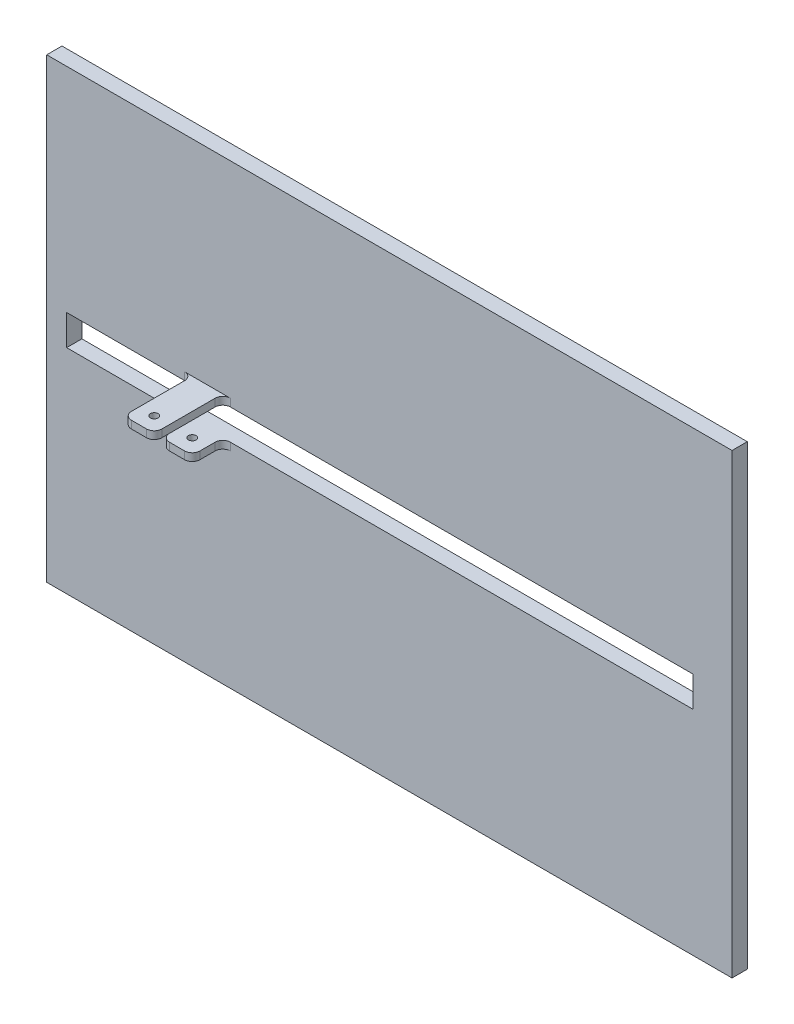
ISO-10303-21;
HEADER;
FILE_DESCRIPTION(('STEP AP214'),'2;1');
FILE_NAME('part.step','',(''),(''),'','','');
FILE_SCHEMA(('AUTOMOTIVE_DESIGN { 1 0 10303 214 1 1 1 1 }'));
ENDSEC;
DATA;
#1=APPLICATION_CONTEXT('core data for automotive mechanical design processes');
#2=APPLICATION_PROTOCOL_DEFINITION('international standard','automotive_design',2000,#1);
#3=PRODUCT_CONTEXT('',#1,'mechanical');
#4=PRODUCT('Part','Part','',(#3));
#5=PRODUCT_RELATED_PRODUCT_CATEGORY('part','',(#4));
#6=PRODUCT_DEFINITION_FORMATION('','',#4);
#7=PRODUCT_DEFINITION_CONTEXT('part definition',#1,'design');
#8=PRODUCT_DEFINITION('design','',#6,#7);
#9=PRODUCT_DEFINITION_SHAPE('','',#8);
#10=(LENGTH_UNIT() NAMED_UNIT(*) SI_UNIT(.MILLI.,.METRE.));
#11=(NAMED_UNIT(*) PLANE_ANGLE_UNIT() SI_UNIT($,.RADIAN.));
#12=(NAMED_UNIT(*) SI_UNIT($,.STERADIAN.) SOLID_ANGLE_UNIT());
#13=UNCERTAINTY_MEASURE_WITH_UNIT(LENGTH_MEASURE(1.E-05),#10,'distance_accuracy_value','');
#14=(GEOMETRIC_REPRESENTATION_CONTEXT(3) GLOBAL_UNCERTAINTY_ASSIGNED_CONTEXT((#13)) GLOBAL_UNIT_ASSIGNED_CONTEXT((#10,
#11,#12)) REPRESENTATION_CONTEXT('',''));
#15=CARTESIAN_POINT('',(0.,0.,0.));
#16=DIRECTION('',(0.,0.,1.));
#17=DIRECTION('',(1.,0.,0.));
#18=AXIS2_PLACEMENT_3D('',#15,#16,#17);
#19=CARTESIAN_POINT('',(-558.838186436975,-20.0000000000002,20.));
#20=DIRECTION('',(0.,1.,0.));
#21=DIRECTION('',(0.,0.,1.));
#22=AXIS2_PLACEMENT_3D('',#19,#20,#21);
#23=PLANE('',#22);
#24=CARTESIAN_POINT('',(-338.838186436974,-19.9999999999991,40.));
#25=DIRECTION('',(0.,-1.,0.));
#26=DIRECTION('',(1.,0.,0.));
#27=AXIS2_PLACEMENT_3D('',#24,#25,#26);
#28=CIRCLE('',#27,4.99999999999999);
#29=CARTESIAN_POINT('',(-333.838186436974,-19.999999999999,40.));
#30=VERTEX_POINT('',#29);
#31=EDGE_CURVE('E377',#30,#30,#28,.T.);
#32=ORIENTED_EDGE('',*,*,#31,.T.);
#33=EDGE_LOOP('',(#32));
#34=FACE_BOUND('',#33,.T.);
#35=DIRECTION('',(1.,0.,0.));
#36=VECTOR('',#35,1.);
#37=CARTESIAN_POINT('',(-558.838186436975,-20.0000000000002,0.));
#38=LINE('',#37,#36);
#39=CARTESIAN_POINT('',(-523.838186436975,-20.0000000000002,0.));
#40=VERTEX_POINT('',#39);
#41=CARTESIAN_POINT('',(298.838186436974,-20.0000000000002,0.));
#42=VERTEX_POINT('',#41);
#43=EDGE_CURVE('E358',#40,#42,#38,.T.);
#44=ORIENTED_EDGE('',*,*,#43,.F.);
#45=DIRECTION('',(0.,0.,-1.));
#46=VECTOR('',#45,1.);
#47=CARTESIAN_POINT('',(-523.838186436975,-20.0000000000002,0.));
#48=LINE('',#47,#46);
#49=CARTESIAN_POINT('',(-523.838186436975,-20.0000000000002,20.));
#50=VERTEX_POINT('',#49);
#51=EDGE_CURVE('E445',#50,#40,#48,.T.);
#52=ORIENTED_EDGE('',*,*,#51,.F.);
#53=DIRECTION('',(1.,0.,0.));
#54=VECTOR('',#53,1.);
#55=CARTESIAN_POINT('',(-558.838186436975,-20.0000000000002,20.));
#56=LINE('',#55,#54);
#57=CARTESIAN_POINT('',(-368.838186436974,-20.0000000000002,20.));
#58=VERTEX_POINT('',#57);
#59=EDGE_CURVE('E419',#50,#58,#56,.T.);
#60=ORIENTED_EDGE('',*,*,#59,.T.);
#61=CARTESIAN_POINT('',(-368.838186436974,-20.0000000000002,30.));
#62=DIRECTION('',(0.,1.,0.));
#63=DIRECTION('',(0.,0.,1.));
#64=AXIS2_PLACEMENT_3D('',#61,#62,#63);
#65=CIRCLE('',#64,10.);
#66=CARTESIAN_POINT('',(-358.838186436974,-19.9999999999992,30.));
#67=VERTEX_POINT('',#66);
#68=EDGE_CURVE('E274',#58,#67,#65,.F.);
#69=ORIENTED_EDGE('',*,*,#68,.T.);
#70=DIRECTION('',(0.,0.,-1.));
#71=VECTOR('',#70,1.);
#72=CARTESIAN_POINT('',(-358.838186436974,-19.9999999999992,60.));
#73=LINE('',#72,#71);
#74=CARTESIAN_POINT('',(-358.838186436974,-19.9999999999992,50.));
#75=VERTEX_POINT('',#74);
#76=EDGE_CURVE('E399',#75,#67,#73,.T.);
#77=ORIENTED_EDGE('',*,*,#76,.F.);
#78=CARTESIAN_POINT('',(-348.838186436974,-20.0000000000002,50.));
#79=DIRECTION('',(0.,1.,0.));
#80=DIRECTION('',(0.,0.,1.));
#81=AXIS2_PLACEMENT_3D('',#78,#79,#80);
#82=CIRCLE('',#81,10.);
#83=CARTESIAN_POINT('',(-348.838186436974,-19.9999999999991,60.));
#84=VERTEX_POINT('',#83);
#85=EDGE_CURVE('E317',#75,#84,#82,.T.);
#86=ORIENTED_EDGE('',*,*,#85,.T.);
#87=DIRECTION('',(-1.,0.,0.));
#88=VECTOR('',#87,1.);
#89=CARTESIAN_POINT('',(-318.838186436974,-19.9999999999989,60.));
#90=LINE('',#89,#88);
#91=CARTESIAN_POINT('',(-328.838186436974,-19.999999999999,60.));
#92=VERTEX_POINT('',#91);
#93=EDGE_CURVE('E390',#92,#84,#90,.T.);
#94=ORIENTED_EDGE('',*,*,#93,.F.);
#95=CARTESIAN_POINT('',(-328.838186436974,-20.0000000000002,50.));
#96=DIRECTION('',(0.,1.,0.));
#97=DIRECTION('',(0.,0.,1.));
#98=AXIS2_PLACEMENT_3D('',#95,#96,#97);
#99=CIRCLE('',#98,10.);
#100=CARTESIAN_POINT('',(-318.838186436974,-19.9999999999989,50.));
#101=VERTEX_POINT('',#100);
#102=EDGE_CURVE('E297',#92,#101,#99,.T.);
#103=ORIENTED_EDGE('',*,*,#102,.T.);
#104=DIRECTION('',(0.,0.,-1.));
#105=VECTOR('',#104,1.);
#106=CARTESIAN_POINT('',(-318.838186436974,-19.9999999999989,60.));
#107=LINE('',#106,#105);
#108=CARTESIAN_POINT('',(-318.838186436974,-19.9999999999989,30.));
#109=VERTEX_POINT('',#108);
#110=EDGE_CURVE('E402',#101,#109,#107,.T.);
#111=ORIENTED_EDGE('',*,*,#110,.T.);
#112=CARTESIAN_POINT('',(-308.838186436974,-20.0000000000002,30.));
#113=DIRECTION('',(0.,1.,0.));
#114=DIRECTION('',(0.,0.,1.));
#115=AXIS2_PLACEMENT_3D('',#112,#113,#114);
#116=CIRCLE('',#115,10.);
#117=CARTESIAN_POINT('',(-308.838186436974,-20.0000000000002,20.));
#118=VERTEX_POINT('',#117);
#119=EDGE_CURVE('E239',#109,#118,#116,.F.);
#120=ORIENTED_EDGE('',*,*,#119,.T.);
#121=CARTESIAN_POINT('',(298.838186436974,-20.0000000000002,20.));
#122=VERTEX_POINT('',#121);
#123=EDGE_CURVE('E423',#118,#122,#56,.T.);
#124=ORIENTED_EDGE('',*,*,#123,.T.);
#125=DIRECTION('',(0.,0.,1.));
#126=VECTOR('',#125,1.);
#127=CARTESIAN_POINT('',(298.838186436974,-20.0000000000002,20.));
#128=LINE('',#127,#126);
#129=EDGE_CURVE('E462',#42,#122,#128,.T.);
#130=ORIENTED_EDGE('',*,*,#129,.F.);
#131=EDGE_LOOP('',(#44,#52,#60,#69,#77,#86,#94,#103,#111,#120,#124,#130));
#132=FACE_BOUND('',#131,.T.);
#133=ADVANCED_FACE('F39',(#34,#132),#23,.T.);
#134=CARTESIAN_POINT('',(558.838186436974,20.,20.));
#135=DIRECTION('',(0.,-1.,0.));
#136=DIRECTION('',(0.,0.,-1.));
#137=AXIS2_PLACEMENT_3D('',#134,#135,#136);
#138=PLANE('',#137);
#139=CARTESIAN_POINT('',(-338.838186436975,20.,90.));
#140=DIRECTION('',(0.,-1.,0.));
#141=DIRECTION('',(0.,0.,-1.));
#142=AXIS2_PLACEMENT_3D('',#139,#140,#141);
#143=CIRCLE('',#142,4.99999999999999);
#144=CARTESIAN_POINT('',(-338.838186436975,20.,85.));
#145=VERTEX_POINT('',#144);
#146=EDGE_CURVE('E471',#145,#145,#143,.T.);
#147=ORIENTED_EDGE('',*,*,#146,.F.);
#148=EDGE_LOOP('',(#147));
#149=FACE_BOUND('',#148,.T.);
#150=DIRECTION('',(-1.,0.,0.));
#151=VECTOR('',#150,1.);
#152=CARTESIAN_POINT('',(558.838186436974,20.,20.));
#153=LINE('',#152,#151);
#154=CARTESIAN_POINT('',(-368.838186436975,20.,20.));
#155=VERTEX_POINT('',#154);
#156=CARTESIAN_POINT('',(-523.838186436975,20.,20.));
#157=VERTEX_POINT('',#156);
#158=EDGE_CURVE('E422',#155,#157,#153,.T.);
#159=ORIENTED_EDGE('',*,*,#158,.T.);
#160=DIRECTION('',(0.,0.,1.));
#161=VECTOR('',#160,1.);
#162=CARTESIAN_POINT('',(-523.838186436975,20.,20.));
#163=LINE('',#162,#161);
#164=CARTESIAN_POINT('',(-523.838186436975,20.,0.));
#165=VERTEX_POINT('',#164);
#166=EDGE_CURVE('E455',#165,#157,#163,.T.);
#167=ORIENTED_EDGE('',*,*,#166,.F.);
#168=DIRECTION('',(-1.,0.,0.));
#169=VECTOR('',#168,1.);
#170=CARTESIAN_POINT('',(558.838186436974,20.,0.));
#171=LINE('',#170,#169);
#172=CARTESIAN_POINT('',(298.838186436974,20.,0.));
#173=VERTEX_POINT('',#172);
#174=EDGE_CURVE('E428',#173,#165,#171,.T.);
#175=ORIENTED_EDGE('',*,*,#174,.F.);
#176=DIRECTION('',(0.,0.,-1.));
#177=VECTOR('',#176,1.);
#178=CARTESIAN_POINT('',(298.838186436974,20.,0.));
#179=LINE('',#178,#177);
#180=CARTESIAN_POINT('',(298.838186436974,20.,20.));
#181=VERTEX_POINT('',#180);
#182=EDGE_CURVE('E468',#181,#173,#179,.T.);
#183=ORIENTED_EDGE('',*,*,#182,.F.);
#184=CARTESIAN_POINT('',(-308.838186436974,20.,20.));
#185=VERTEX_POINT('',#184);
#186=EDGE_CURVE('E227',#181,#185,#153,.T.);
#187=ORIENTED_EDGE('',*,*,#186,.T.);
#188=CARTESIAN_POINT('',(-308.838186436974,20.,30.));
#189=DIRECTION('',(0.,-1.,0.));
#190=DIRECTION('',(0.,0.,-1.));
#191=AXIS2_PLACEMENT_3D('',#188,#189,#190);
#192=CIRCLE('',#191,10.);
#193=CARTESIAN_POINT('',(-318.838186436974,20.,30.));
#194=VERTEX_POINT('',#193);
#195=EDGE_CURVE('E258',#185,#194,#192,.F.);
#196=ORIENTED_EDGE('',*,*,#195,.T.);
#197=DIRECTION('',(0.,0.,-1.));
#198=VECTOR('',#197,1.);
#199=CARTESIAN_POINT('',(-318.838186436974,20.,60.));
#200=LINE('',#199,#198);
#201=CARTESIAN_POINT('',(-318.838186436974,20.,100.));
#202=VERTEX_POINT('',#201);
#203=EDGE_CURVE('E346',#202,#194,#200,.T.);
#204=ORIENTED_EDGE('',*,*,#203,.F.);
#205=CARTESIAN_POINT('',(-328.838186436974,20.,100.));
#206=DIRECTION('',(0.,-1.,0.));
#207=DIRECTION('',(0.,0.,-1.));
#208=AXIS2_PLACEMENT_3D('',#205,#206,#207);
#209=CIRCLE('',#208,10.);
#210=CARTESIAN_POINT('',(-328.838186436974,20.,110.));
#211=VERTEX_POINT('',#210);
#212=EDGE_CURVE('E11',#202,#211,#209,.T.);
#213=ORIENTED_EDGE('',*,*,#212,.T.);
#214=DIRECTION('',(1.,0.,0.));
#215=VECTOR('',#214,1.);
#216=CARTESIAN_POINT('',(-318.838186436974,20.,110.));
#217=LINE('',#216,#215);
#218=CARTESIAN_POINT('',(-348.838186436974,20.,110.));
#219=VERTEX_POINT('',#218);
#220=EDGE_CURVE('E365',#219,#211,#217,.T.);
#221=ORIENTED_EDGE('',*,*,#220,.F.);
#222=CARTESIAN_POINT('',(-348.838186436974,20.,100.));
#223=DIRECTION('',(0.,-1.,0.));
#224=DIRECTION('',(0.,0.,-1.));
#225=AXIS2_PLACEMENT_3D('',#222,#223,#224);
#226=CIRCLE('',#225,10.);
#227=CARTESIAN_POINT('',(-358.838186436974,20.,100.));
#228=VERTEX_POINT('',#227);
#229=EDGE_CURVE('E324',#219,#228,#226,.T.);
#230=ORIENTED_EDGE('',*,*,#229,.T.);
#231=DIRECTION('',(0.,0.,-1.));
#232=VECTOR('',#231,1.);
#233=CARTESIAN_POINT('',(-358.838186436974,20.,60.));
#234=LINE('',#233,#232);
#235=CARTESIAN_POINT('',(-358.838186436974,20.,30.));
#236=VERTEX_POINT('',#235);
#237=EDGE_CURVE('E411',#228,#236,#234,.T.);
#238=ORIENTED_EDGE('',*,*,#237,.T.);
#239=CARTESIAN_POINT('',(-368.838186436974,20.,30.));
#240=DIRECTION('',(0.,-1.,0.));
#241=DIRECTION('',(0.,0.,-1.));
#242=AXIS2_PLACEMENT_3D('',#239,#240,#241);
#243=CIRCLE('',#242,10.);
#244=EDGE_CURVE('E286',#236,#155,#243,.F.);
#245=ORIENTED_EDGE('',*,*,#244,.T.);
#246=EDGE_LOOP('',(#159,#167,#175,#183,#187,#196,#204,#213,#221,#230,#238,#245));
#247=FACE_BOUND('',#246,.T.);
#248=ADVANCED_FACE('F352',(#149,#247),#138,.T.);
#249=CARTESIAN_POINT('',(0.,0.,20.));
#250=DIRECTION('',(0.,0.,1.));
#251=DIRECTION('',(1.,0.,0.));
#252=AXIS2_PLACEMENT_3D('',#249,#250,#251);
#253=PLANE('',#252);
#254=DIRECTION('',(0.,-1.,0.));
#255=VECTOR('',#254,1.);
#256=CARTESIAN_POINT('',(350.,-300.,20.));
#257=LINE('',#256,#255);
#258=CARTESIAN_POINT('',(350.,300.,20.));
#259=VERTEX_POINT('',#258);
#260=CARTESIAN_POINT('',(350.,-300.,20.));
#261=VERTEX_POINT('',#260);
#262=EDGE_CURVE('E55',#259,#261,#257,.T.);
#263=ORIENTED_EDGE('',*,*,#262,.F.);
#264=DIRECTION('',(-1.,0.,0.));
#265=VECTOR('',#264,1.);
#266=CARTESIAN_POINT('',(-650.,300.,20.));
#267=LINE('',#266,#265);
#268=CARTESIAN_POINT('',(-550.,300.,20.));
#269=VERTEX_POINT('',#268);
#270=EDGE_CURVE('E221',#259,#269,#267,.T.);
#271=ORIENTED_EDGE('',*,*,#270,.T.);
#272=DIRECTION('',(0.,1.,0.));
#273=VECTOR('',#272,1.);
#274=CARTESIAN_POINT('',(-550.,300.,20.));
#275=LINE('',#274,#273);
#276=CARTESIAN_POINT('',(-550.,-300.,20.));
#277=VERTEX_POINT('',#276);
#278=EDGE_CURVE('E438',#277,#269,#275,.T.);
#279=ORIENTED_EDGE('',*,*,#278,.F.);
#280=DIRECTION('',(1.,0.,0.));
#281=VECTOR('',#280,1.);
#282=CARTESIAN_POINT('',(-650.,-300.,20.));
#283=LINE('',#282,#281);
#284=EDGE_CURVE('E225',#277,#261,#283,.T.);
#285=ORIENTED_EDGE('',*,*,#284,.T.);
#286=EDGE_LOOP('',(#263,#271,#279,#285));
#287=FACE_BOUND('',#286,.T.);
#288=ORIENTED_EDGE('',*,*,#59,.F.);
#289=DIRECTION('',(0.,-1.,0.));
#290=VECTOR('',#289,1.);
#291=CARTESIAN_POINT('',(-523.838186436975,-20.0000000000002,20.));
#292=LINE('',#291,#290);
#293=EDGE_CURVE('E441',#157,#50,#292,.T.);
#294=ORIENTED_EDGE('',*,*,#293,.F.);
#295=ORIENTED_EDGE('',*,*,#158,.F.);
#296=DIRECTION('',(0.,-1.,0.));
#297=VECTOR('',#296,1.);
#298=CARTESIAN_POINT('',(-368.838186436974,0.,20.));
#299=LINE('',#298,#297);
#300=CARTESIAN_POINT('',(-368.838186436974,30.,20.));
#301=VERTEX_POINT('',#300);
#302=EDGE_CURVE('E282',#155,#301,#299,.F.);
#303=ORIENTED_EDGE('',*,*,#302,.T.);
#304=DIRECTION('',(-1.,0.,0.));
#305=VECTOR('',#304,1.);
#306=CARTESIAN_POINT('',(-358.838186436974,30.,20.));
#307=LINE('',#306,#305);
#308=CARTESIAN_POINT('',(-308.838186436974,30.,20.));
#309=VERTEX_POINT('',#308);
#310=EDGE_CURVE('E408',#309,#301,#307,.T.);
#311=ORIENTED_EDGE('',*,*,#310,.F.);
#312=DIRECTION('',(0.,1.,0.));
#313=VECTOR('',#312,1.);
#314=CARTESIAN_POINT('',(-308.838186436974,0.,20.));
#315=LINE('',#314,#313);
#316=EDGE_CURVE('E250',#309,#185,#315,.F.);
#317=ORIENTED_EDGE('',*,*,#316,.T.);
#318=ORIENTED_EDGE('',*,*,#186,.F.);
#319=DIRECTION('',(0.,1.,0.));
#320=VECTOR('',#319,1.);
#321=CARTESIAN_POINT('',(298.838186436974,20.,20.));
#322=LINE('',#321,#320);
#323=EDGE_CURVE('E465',#122,#181,#322,.T.);
#324=ORIENTED_EDGE('',*,*,#323,.F.);
#325=ORIENTED_EDGE('',*,*,#123,.F.);
#326=DIRECTION('',(0.,1.,0.));
#327=VECTOR('',#326,1.);
#328=CARTESIAN_POINT('',(-308.838186436974,-1.71439632732902E-12,20.));
#329=LINE('',#328,#327);
#330=CARTESIAN_POINT('',(-308.838186436974,-29.9999999999989,20.));
#331=VERTEX_POINT('',#330);
#332=EDGE_CURVE('E235',#118,#331,#329,.F.);
#333=ORIENTED_EDGE('',*,*,#332,.T.);
#334=DIRECTION('',(1.,0.,0.));
#335=VECTOR('',#334,1.);
#336=CARTESIAN_POINT('',(-358.838186436974,-29.9999999999992,20.));
#337=LINE('',#336,#335);
#338=CARTESIAN_POINT('',(-368.838186436974,-29.9999999999992,20.));
#339=VERTEX_POINT('',#338);
#340=EDGE_CURVE('E385',#339,#331,#337,.T.);
#341=ORIENTED_EDGE('',*,*,#340,.F.);
#342=DIRECTION('',(0.,-1.,0.));
#343=VECTOR('',#342,1.);
#344=CARTESIAN_POINT('',(-368.838186436974,-2.04746323471658E-12,20.));
#345=LINE('',#344,#343);
#346=EDGE_CURVE('E266',#339,#58,#345,.F.);
#347=ORIENTED_EDGE('',*,*,#346,.T.);
#348=EDGE_LOOP('',(#288,#294,#295,#303,#311,#317,#318,#324,#325,#333,#341,#347));
#349=FACE_BOUND('',#348,.T.);
#350=ADVANCED_FACE('F434',(#287,#349),#253,.T.);
#351=CARTESIAN_POINT('',(0.,0.,0.));
#352=DIRECTION('',(0.,0.,1.));
#353=DIRECTION('',(1.,0.,0.));
#354=AXIS2_PLACEMENT_3D('',#351,#352,#353);
#355=PLANE('',#354);
#356=DIRECTION('',(0.,1.,0.));
#357=VECTOR('',#356,1.);
#358=CARTESIAN_POINT('',(-523.838186436975,20.,0.));
#359=LINE('',#358,#357);
#360=EDGE_CURVE('E452',#40,#165,#359,.T.);
#361=ORIENTED_EDGE('',*,*,#360,.F.);
#362=ORIENTED_EDGE('',*,*,#43,.T.);
#363=DIRECTION('',(0.,-1.,0.));
#364=VECTOR('',#363,1.);
#365=CARTESIAN_POINT('',(298.838186436974,-20.0000000000002,0.));
#366=LINE('',#365,#364);
#367=EDGE_CURVE('E458',#173,#42,#366,.T.);
#368=ORIENTED_EDGE('',*,*,#367,.F.);
#369=ORIENTED_EDGE('',*,*,#174,.T.);
#370=EDGE_LOOP('',(#361,#362,#368,#369));
#371=FACE_BOUND('',#370,.T.);
#372=DIRECTION('',(-1.,0.,0.));
#373=VECTOR('',#372,1.);
#374=CARTESIAN_POINT('',(-650.,300.,0.));
#375=LINE('',#374,#373);
#376=CARTESIAN_POINT('',(350.,300.,0.));
#377=VERTEX_POINT('',#376);
#378=CARTESIAN_POINT('',(-550.,300.,0.));
#379=VERTEX_POINT('',#378);
#380=EDGE_CURVE('E214',#377,#379,#375,.T.);
#381=ORIENTED_EDGE('',*,*,#380,.F.);
#382=DIRECTION('',(0.,1.,0.));
#383=VECTOR('',#382,1.);
#384=CARTESIAN_POINT('',(350.,300.,0.));
#385=LINE('',#384,#383);
#386=CARTESIAN_POINT('',(350.,-300.,0.));
#387=VERTEX_POINT('',#386);
#388=EDGE_CURVE('E201',#387,#377,#385,.T.);
#389=ORIENTED_EDGE('',*,*,#388,.F.);
#390=DIRECTION('',(1.,0.,0.));
#391=VECTOR('',#390,1.);
#392=CARTESIAN_POINT('',(-650.,-300.,0.));
#393=LINE('',#392,#391);
#394=CARTESIAN_POINT('',(-550.,-300.,0.));
#395=VERTEX_POINT('',#394);
#396=EDGE_CURVE('E213',#395,#387,#393,.T.);
#397=ORIENTED_EDGE('',*,*,#396,.F.);
#398=DIRECTION('',(0.,-1.,0.));
#399=VECTOR('',#398,1.);
#400=CARTESIAN_POINT('',(-550.,-300.,0.));
#401=LINE('',#400,#399);
#402=EDGE_CURVE('E63',#379,#395,#401,.T.);
#403=ORIENTED_EDGE('',*,*,#402,.F.);
#404=EDGE_LOOP('',(#381,#389,#397,#403));
#405=FACE_BOUND('',#404,.T.);
#406=ADVANCED_FACE('F212',(#371,#405),#355,.F.);
#407=CARTESIAN_POINT('',(-650.,300.,20.));
#408=DIRECTION('',(0.,-1.,0.));
#409=DIRECTION('',(0.,0.,-1.));
#410=AXIS2_PLACEMENT_3D('',#407,#408,#409);
#411=PLANE('',#410);
#412=ORIENTED_EDGE('',*,*,#270,.F.);
#413=DIRECTION('',(0.,0.,1.));
#414=VECTOR('',#413,1.);
#415=CARTESIAN_POINT('',(350.,300.,20.));
#416=LINE('',#415,#414);
#417=EDGE_CURVE('E216',#377,#259,#416,.T.);
#418=ORIENTED_EDGE('',*,*,#417,.F.);
#419=ORIENTED_EDGE('',*,*,#380,.T.);
#420=DIRECTION('',(0.,0.,-1.));
#421=VECTOR('',#420,1.);
#422=CARTESIAN_POINT('',(-550.,300.,0.));
#423=LINE('',#422,#421);
#424=EDGE_CURVE('E760',#269,#379,#423,.T.);
#425=ORIENTED_EDGE('',*,*,#424,.F.);
#426=EDGE_LOOP('',(#412,#418,#419,#425));
#427=FACE_BOUND('',#426,.T.);
#428=ADVANCED_FACE('F495',(#427),#411,.F.);
#429=CARTESIAN_POINT('',(-650.,-300.,20.));
#430=DIRECTION('',(0.,1.,0.));
#431=DIRECTION('',(0.,0.,1.));
#432=AXIS2_PLACEMENT_3D('',#429,#430,#431);
#433=PLANE('',#432);
#434=ORIENTED_EDGE('',*,*,#396,.T.);
#435=DIRECTION('',(0.,0.,-1.));
#436=VECTOR('',#435,1.);
#437=CARTESIAN_POINT('',(350.,-300.,0.));
#438=LINE('',#437,#436);
#439=EDGE_CURVE('E198',#261,#387,#438,.T.);
#440=ORIENTED_EDGE('',*,*,#439,.F.);
#441=ORIENTED_EDGE('',*,*,#284,.F.);
#442=DIRECTION('',(0.,0.,1.));
#443=VECTOR('',#442,1.);
#444=CARTESIAN_POINT('',(-550.,-300.,20.));
#445=LINE('',#444,#443);
#446=EDGE_CURVE('E219',#395,#277,#445,.T.);
#447=ORIENTED_EDGE('',*,*,#446,.F.);
#448=EDGE_LOOP('',(#434,#440,#441,#447));
#449=FACE_BOUND('',#448,.T.);
#450=ADVANCED_FACE('F218',(#449),#433,.F.);
#451=CARTESIAN_POINT('',(-318.838186436974,30.,60.));
#452=DIRECTION('',(-1.,0.,0.));
#453=DIRECTION('',(0.,0.,1.));
#454=AXIS2_PLACEMENT_3D('',#451,#452,#453);
#455=PLANE('',#454);
#456=DIRECTION('',(0.,0.,-1.));
#457=VECTOR('',#456,1.);
#458=CARTESIAN_POINT('',(-318.838186436974,30.,60.));
#459=LINE('',#458,#457);
#460=CARTESIAN_POINT('',(-318.838186436974,30.,100.));
#461=VERTEX_POINT('',#460);
#462=CARTESIAN_POINT('',(-318.838186436974,30.,30.));
#463=VERTEX_POINT('',#462);
#464=EDGE_CURVE('E347',#461,#463,#459,.T.);
#465=ORIENTED_EDGE('',*,*,#464,.F.);
#466=DIRECTION('',(0.,1.,0.));
#467=VECTOR('',#466,1.);
#468=CARTESIAN_POINT('',(-318.838186436974,30.,100.));
#469=LINE('',#468,#467);
#470=EDGE_CURVE('E48',#461,#202,#469,.F.);
#471=ORIENTED_EDGE('',*,*,#470,.T.);
#472=ORIENTED_EDGE('',*,*,#203,.T.);
#473=DIRECTION('',(0.,1.,0.));
#474=VECTOR('',#473,1.);
#475=CARTESIAN_POINT('',(-318.838186436974,30.,30.));
#476=LINE('',#475,#474);
#477=EDGE_CURVE('E246',#194,#463,#476,.T.);
#478=ORIENTED_EDGE('',*,*,#477,.T.);
#479=EDGE_LOOP('',(#465,#471,#472,#478));
#480=FACE_BOUND('',#479,.T.);
#481=ADVANCED_FACE('F345',(#480),#455,.F.);
#482=CARTESIAN_POINT('',(-358.838186436974,30.,60.));
#483=DIRECTION('',(0.,-1.,0.));
#484=DIRECTION('',(0.,0.,-1.));
#485=AXIS2_PLACEMENT_3D('',#482,#483,#484);
#486=PLANE('',#485);
#487=CARTESIAN_POINT('',(-338.838186436975,30.,90.));
#488=DIRECTION('',(0.,-1.,0.));
#489=DIRECTION('',(0.,0.,-1.));
#490=AXIS2_PLACEMENT_3D('',#487,#488,#489);
#491=CIRCLE('',#490,4.99999999999999);
#492=CARTESIAN_POINT('',(-338.838186436975,30.,85.));
#493=VERTEX_POINT('',#492);
#494=EDGE_CURVE('E379',#493,#493,#491,.T.);
#495=ORIENTED_EDGE('',*,*,#494,.T.);
#496=EDGE_LOOP('',(#495));
#497=FACE_BOUND('',#496,.T.);
#498=DIRECTION('',(-1.,0.,0.));
#499=VECTOR('',#498,1.);
#500=CARTESIAN_POINT('',(-358.838186436974,30.,110.));
#501=LINE('',#500,#499);
#502=CARTESIAN_POINT('',(-328.838186436974,30.,110.));
#503=VERTEX_POINT('',#502);
#504=CARTESIAN_POINT('',(-348.838186436974,30.,110.));
#505=VERTEX_POINT('',#504);
#506=EDGE_CURVE('E364',#503,#505,#501,.T.);
#507=ORIENTED_EDGE('',*,*,#506,.F.);
#508=CARTESIAN_POINT('',(-328.838186436974,30.,100.));
#509=DIRECTION('',(0.,-1.,0.));
#510=DIRECTION('',(0.,0.,-1.));
#511=AXIS2_PLACEMENT_3D('',#508,#509,#510);
#512=CIRCLE('',#511,10.);
#513=EDGE_CURVE('E338',#503,#461,#512,.F.);
#514=ORIENTED_EDGE('',*,*,#513,.T.);
#515=ORIENTED_EDGE('',*,*,#464,.T.);
#516=CARTESIAN_POINT('',(-308.838186436974,30.,30.));
#517=DIRECTION('',(0.,-1.,0.));
#518=DIRECTION('',(0.,0.,-1.));
#519=AXIS2_PLACEMENT_3D('',#516,#517,#518);
#520=CIRCLE('',#519,10.);
#521=EDGE_CURVE('E254',#463,#309,#520,.T.);
#522=ORIENTED_EDGE('',*,*,#521,.T.);
#523=ORIENTED_EDGE('',*,*,#310,.T.);
#524=CARTESIAN_POINT('',(-368.838186436974,30.,30.));
#525=DIRECTION('',(0.,-1.,0.));
#526=DIRECTION('',(0.,0.,-1.));
#527=AXIS2_PLACEMENT_3D('',#524,#525,#526);
#528=CIRCLE('',#527,10.);
#529=CARTESIAN_POINT('',(-358.838186436974,30.,30.));
#530=VERTEX_POINT('',#529);
#531=EDGE_CURVE('E289',#301,#530,#528,.T.);
#532=ORIENTED_EDGE('',*,*,#531,.T.);
#533=DIRECTION('',(0.,0.,-1.));
#534=VECTOR('',#533,1.);
#535=CARTESIAN_POINT('',(-358.838186436974,30.,60.));
#536=LINE('',#535,#534);
#537=CARTESIAN_POINT('',(-358.838186436974,30.,100.));
#538=VERTEX_POINT('',#537);
#539=EDGE_CURVE('E414',#538,#530,#536,.T.);
#540=ORIENTED_EDGE('',*,*,#539,.F.);
#541=CARTESIAN_POINT('',(-348.838186436974,30.,100.));
#542=DIRECTION('',(0.,-1.,0.));
#543=DIRECTION('',(0.,0.,-1.));
#544=AXIS2_PLACEMENT_3D('',#541,#542,#543);
#545=CIRCLE('',#544,10.);
#546=EDGE_CURVE('E330',#538,#505,#545,.F.);
#547=ORIENTED_EDGE('',*,*,#546,.T.);
#548=EDGE_LOOP('',(#507,#514,#515,#522,#523,#532,#540,#547));
#549=FACE_BOUND('',#548,.T.);
#550=ADVANCED_FACE('F367',(#497,#549),#486,.F.);
#551=CARTESIAN_POINT('',(-358.838186436974,20.,60.));
#552=DIRECTION('',(1.,0.,0.));
#553=DIRECTION('',(0.,0.,-1.));
#554=AXIS2_PLACEMENT_3D('',#551,#552,#553);
#555=PLANE('',#554);
#556=ORIENTED_EDGE('',*,*,#237,.F.);
#557=DIRECTION('',(0.,-1.,0.));
#558=VECTOR('',#557,1.);
#559=CARTESIAN_POINT('',(-358.838186436974,20.,100.));
#560=LINE('',#559,#558);
#561=EDGE_CURVE('E327',#228,#538,#560,.F.);
#562=ORIENTED_EDGE('',*,*,#561,.T.);
#563=ORIENTED_EDGE('',*,*,#539,.T.);
#564=DIRECTION('',(0.,-1.,0.));
#565=VECTOR('',#564,1.);
#566=CARTESIAN_POINT('',(-358.838186436974,20.,30.));
#567=LINE('',#566,#565);
#568=EDGE_CURVE('E278',#530,#236,#567,.T.);
#569=ORIENTED_EDGE('',*,*,#568,.T.);
#570=EDGE_LOOP('',(#556,#562,#563,#569));
#571=FACE_BOUND('',#570,.T.);
#572=ADVANCED_FACE('F536',(#571),#555,.F.);
#573=CARTESIAN_POINT('',(-358.838186436974,-29.9999999999992,60.));
#574=DIRECTION('',(0.,1.,0.));
#575=DIRECTION('',(-1.,0.,0.));
#576=AXIS2_PLACEMENT_3D('',#573,#574,#575);
#577=PLANE('',#576);
#578=CARTESIAN_POINT('',(-338.838186436974,-29.9999999999991,40.));
#579=DIRECTION('',(0.,-1.,0.));
#580=DIRECTION('',(1.,0.,0.));
#581=AXIS2_PLACEMENT_3D('',#578,#579,#580);
#582=CIRCLE('',#581,4.99999999999999);
#583=CARTESIAN_POINT('',(-333.838186436974,-29.999999999999,40.));
#584=VERTEX_POINT('',#583);
#585=EDGE_CURVE('E372',#584,#584,#582,.T.);
#586=ORIENTED_EDGE('',*,*,#585,.F.);
#587=EDGE_LOOP('',(#586));
#588=FACE_BOUND('',#587,.T.);
#589=DIRECTION('',(1.,0.,0.));
#590=VECTOR('',#589,1.);
#591=CARTESIAN_POINT('',(-358.838186436974,-29.9999999999992,60.));
#592=LINE('',#591,#590);
#593=CARTESIAN_POINT('',(-348.838186436974,-29.9999999999991,60.));
#594=VERTEX_POINT('',#593);
#595=CARTESIAN_POINT('',(-328.838186436974,-29.999999999999,60.));
#596=VERTEX_POINT('',#595);
#597=EDGE_CURVE('E387',#594,#596,#592,.T.);
#598=ORIENTED_EDGE('',*,*,#597,.F.);
#599=CARTESIAN_POINT('',(-348.838186436974,-29.9999999999991,50.));
#600=DIRECTION('',(0.,1.,0.));
#601=DIRECTION('',(-1.,0.,0.));
#602=AXIS2_PLACEMENT_3D('',#599,#600,#601);
#603=CIRCLE('',#602,10.);
#604=CARTESIAN_POINT('',(-358.838186436974,-29.9999999999992,50.));
#605=VERTEX_POINT('',#604);
#606=EDGE_CURVE('E311',#594,#605,#603,.F.);
#607=ORIENTED_EDGE('',*,*,#606,.T.);
#608=DIRECTION('',(0.,0.,-1.));
#609=VECTOR('',#608,1.);
#610=CARTESIAN_POINT('',(-358.838186436974,-29.9999999999992,60.));
#611=LINE('',#610,#609);
#612=CARTESIAN_POINT('',(-358.838186436974,-29.9999999999992,30.));
#613=VERTEX_POINT('',#612);
#614=EDGE_CURVE('E394',#605,#613,#611,.T.);
#615=ORIENTED_EDGE('',*,*,#614,.T.);
#616=CARTESIAN_POINT('',(-368.838186436974,-29.9999999999992,30.));
#617=DIRECTION('',(0.,1.,0.));
#618=DIRECTION('',(-1.,0.,0.));
#619=AXIS2_PLACEMENT_3D('',#616,#617,#618);
#620=CIRCLE('',#619,10.);
#621=EDGE_CURVE('E270',#613,#339,#620,.T.);
#622=ORIENTED_EDGE('',*,*,#621,.T.);
#623=ORIENTED_EDGE('',*,*,#340,.T.);
#624=CARTESIAN_POINT('',(-308.838186436974,-29.9999999999989,30.));
#625=DIRECTION('',(0.,1.,0.));
#626=DIRECTION('',(-1.,0.,0.));
#627=AXIS2_PLACEMENT_3D('',#624,#625,#626);
#628=CIRCLE('',#627,10.);
#629=CARTESIAN_POINT('',(-318.838186436974,-29.9999999999989,30.));
#630=VERTEX_POINT('',#629);
#631=EDGE_CURVE('E242',#331,#630,#628,.T.);
#632=ORIENTED_EDGE('',*,*,#631,.T.);
#633=DIRECTION('',(0.,0.,-1.));
#634=VECTOR('',#633,1.);
#635=CARTESIAN_POINT('',(-318.838186436974,-29.9999999999989,60.));
#636=LINE('',#635,#634);
#637=CARTESIAN_POINT('',(-318.838186436974,-29.9999999999989,50.));
#638=VERTEX_POINT('',#637);
#639=EDGE_CURVE('E405',#638,#630,#636,.T.);
#640=ORIENTED_EDGE('',*,*,#639,.F.);
#641=CARTESIAN_POINT('',(-328.838186436974,-29.999999999999,50.));
#642=DIRECTION('',(0.,1.,0.));
#643=DIRECTION('',(-1.,0.,0.));
#644=AXIS2_PLACEMENT_3D('',#641,#642,#643);
#645=CIRCLE('',#644,10.);
#646=EDGE_CURVE('E303',#638,#596,#645,.F.);
#647=ORIENTED_EDGE('',*,*,#646,.T.);
#648=EDGE_LOOP('',(#598,#607,#615,#622,#623,#632,#640,#647));
#649=FACE_BOUND('',#648,.T.);
#650=ADVANCED_FACE('F560',(#588,#649),#577,.F.);
#651=CARTESIAN_POINT('',(-318.838186436974,-29.9999999999989,60.));
#652=DIRECTION('',(-1.,0.,0.));
#653=DIRECTION('',(0.,-1.,0.));
#654=AXIS2_PLACEMENT_3D('',#651,#652,#653);
#655=PLANE('',#654);
#656=ORIENTED_EDGE('',*,*,#110,.F.);
#657=DIRECTION('',(0.,1.,0.));
#658=VECTOR('',#657,1.);
#659=CARTESIAN_POINT('',(-318.838186436974,-29.9999999999989,50.));
#660=LINE('',#659,#658);
#661=EDGE_CURVE('E300',#101,#638,#660,.F.);
#662=ORIENTED_EDGE('',*,*,#661,.T.);
#663=ORIENTED_EDGE('',*,*,#639,.T.);
#664=DIRECTION('',(0.,1.,0.));
#665=VECTOR('',#664,1.);
#666=CARTESIAN_POINT('',(-318.838186436974,-29.9999999999989,30.));
#667=LINE('',#666,#665);
#668=EDGE_CURVE('E231',#630,#109,#667,.T.);
#669=ORIENTED_EDGE('',*,*,#668,.T.);
#670=EDGE_LOOP('',(#656,#662,#663,#669));
#671=FACE_BOUND('',#670,.T.);
#672=ADVANCED_FACE('F603',(#671),#655,.F.);
#673=CARTESIAN_POINT('',(-358.838186436974,-19.9999999999992,60.));
#674=DIRECTION('',(1.,0.,0.));
#675=DIRECTION('',(0.,1.,0.));
#676=AXIS2_PLACEMENT_3D('',#673,#674,#675);
#677=PLANE('',#676);
#678=ORIENTED_EDGE('',*,*,#614,.F.);
#679=DIRECTION('',(0.,-1.,0.));
#680=VECTOR('',#679,1.);
#681=CARTESIAN_POINT('',(-358.838186436974,-19.9999999999992,50.));
#682=LINE('',#681,#680);
#683=EDGE_CURVE('E314',#605,#75,#682,.F.);
#684=ORIENTED_EDGE('',*,*,#683,.T.);
#685=ORIENTED_EDGE('',*,*,#76,.T.);
#686=DIRECTION('',(0.,-1.,0.));
#687=VECTOR('',#686,1.);
#688=CARTESIAN_POINT('',(-358.838186436974,-19.9999999999992,30.));
#689=LINE('',#688,#687);
#690=EDGE_CURVE('E262',#67,#613,#689,.T.);
#691=ORIENTED_EDGE('',*,*,#690,.T.);
#692=EDGE_LOOP('',(#678,#684,#685,#691));
#693=FACE_BOUND('',#692,.T.);
#694=ADVANCED_FACE('F599',(#693),#677,.F.);
#695=CARTESIAN_POINT('',(0.,0.,60.));
#696=DIRECTION('',(0.,0.,1.));
#697=DIRECTION('',(1.,0.,0.));
#698=AXIS2_PLACEMENT_3D('',#695,#696,#697);
#699=PLANE('',#698);
#700=ORIENTED_EDGE('',*,*,#93,.T.);
#701=DIRECTION('',(0.,-1.,0.));
#702=VECTOR('',#701,1.);
#703=CARTESIAN_POINT('',(-348.838186436974,-29.9999999999991,60.));
#704=LINE('',#703,#702);
#705=EDGE_CURVE('E307',#84,#594,#704,.T.);
#706=ORIENTED_EDGE('',*,*,#705,.T.);
#707=ORIENTED_EDGE('',*,*,#597,.T.);
#708=DIRECTION('',(0.,1.,0.));
#709=VECTOR('',#708,1.);
#710=CARTESIAN_POINT('',(-328.838186436974,-19.999999999999,60.));
#711=LINE('',#710,#709);
#712=EDGE_CURVE('E293',#596,#92,#711,.T.);
#713=ORIENTED_EDGE('',*,*,#712,.T.);
#714=EDGE_LOOP('',(#700,#706,#707,#713));
#715=FACE_BOUND('',#714,.T.);
#716=ADVANCED_FACE('F595',(#715),#699,.T.);
#717=CARTESIAN_POINT('',(-338.838186436974,-19.9999999999991,40.));
#718=DIRECTION('',(0.,-1.,0.));
#719=DIRECTION('',(1.,0.,0.));
#720=AXIS2_PLACEMENT_3D('',#717,#718,#719);
#721=CYLINDRICAL_SURFACE('',#720,4.99999999999999);
#722=ORIENTED_EDGE('',*,*,#31,.F.);
#723=EDGE_LOOP('',(#722));
#724=FACE_BOUND('',#723,.T.);
#725=ORIENTED_EDGE('',*,*,#585,.T.);
#726=EDGE_LOOP('',(#725));
#727=FACE_BOUND('',#726,.T.);
#728=ADVANCED_FACE('F592',(#724,#727),#721,.F.);
#729=CARTESIAN_POINT('',(0.,0.,110.));
#730=DIRECTION('',(0.,0.,-1.));
#731=DIRECTION('',(-1.,0.,0.));
#732=AXIS2_PLACEMENT_3D('',#729,#730,#731);
#733=PLANE('',#732);
#734=ORIENTED_EDGE('',*,*,#220,.T.);
#735=DIRECTION('',(0.,1.,0.));
#736=VECTOR('',#735,1.);
#737=CARTESIAN_POINT('',(-328.838186436974,0.,110.));
#738=LINE('',#737,#736);
#739=EDGE_CURVE('E334',#211,#503,#738,.T.);
#740=ORIENTED_EDGE('',*,*,#739,.T.);
#741=ORIENTED_EDGE('',*,*,#506,.T.);
#742=DIRECTION('',(0.,-1.,0.));
#743=VECTOR('',#742,1.);
#744=CARTESIAN_POINT('',(-348.838186436974,0.,110.));
#745=LINE('',#744,#743);
#746=EDGE_CURVE('E320',#505,#219,#745,.T.);
#747=ORIENTED_EDGE('',*,*,#746,.T.);
#748=EDGE_LOOP('',(#734,#740,#741,#747));
#749=FACE_BOUND('',#748,.T.);
#750=ADVANCED_FACE('F363',(#749),#733,.F.);
#751=CARTESIAN_POINT('',(-338.838186436975,30.,90.));
#752=DIRECTION('',(0.,-1.,0.));
#753=DIRECTION('',(0.,0.,-1.));
#754=AXIS2_PLACEMENT_3D('',#751,#752,#753);
#755=CYLINDRICAL_SURFACE('',#754,4.99999999999999);
#756=ORIENTED_EDGE('',*,*,#494,.F.);
#757=EDGE_LOOP('',(#756));
#758=FACE_BOUND('',#757,.T.);
#759=ORIENTED_EDGE('',*,*,#146,.T.);
#760=EDGE_LOOP('',(#759));
#761=FACE_BOUND('',#760,.T.);
#762=ADVANCED_FACE('F478',(#758,#761),#755,.F.);
#763=CARTESIAN_POINT('',(-308.838186436974,-29.9999999999989,30.));
#764=DIRECTION('',(0.,1.,0.));
#765=DIRECTION('',(-1.,0.,0.));
#766=AXIS2_PLACEMENT_3D('',#763,#764,#765);
#767=CYLINDRICAL_SURFACE('',#766,10.);
#768=ORIENTED_EDGE('',*,*,#631,.F.);
#769=ORIENTED_EDGE('',*,*,#332,.F.);
#770=ORIENTED_EDGE('',*,*,#119,.F.);
#771=ORIENTED_EDGE('',*,*,#668,.F.);
#772=EDGE_LOOP('',(#768,#769,#770,#771));
#773=FACE_BOUND('',#772,.T.);
#774=ADVANCED_FACE('F502',(#773),#767,.F.);
#775=CARTESIAN_POINT('',(-308.838186436974,30.,30.));
#776=DIRECTION('',(0.,1.,0.));
#777=DIRECTION('',(0.,0.,1.));
#778=AXIS2_PLACEMENT_3D('',#775,#776,#777);
#779=CYLINDRICAL_SURFACE('',#778,10.);
#780=ORIENTED_EDGE('',*,*,#195,.F.);
#781=ORIENTED_EDGE('',*,*,#316,.F.);
#782=ORIENTED_EDGE('',*,*,#521,.F.);
#783=ORIENTED_EDGE('',*,*,#477,.F.);
#784=EDGE_LOOP('',(#780,#781,#782,#783));
#785=FACE_BOUND('',#784,.T.);
#786=ADVANCED_FACE('F505',(#785),#779,.F.);
#787=CARTESIAN_POINT('',(-368.838186436974,-19.9999999999992,30.));
#788=DIRECTION('',(0.,-1.,0.));
#789=DIRECTION('',(1.,0.,0.));
#790=AXIS2_PLACEMENT_3D('',#787,#788,#789);
#791=CYLINDRICAL_SURFACE('',#790,10.);
#792=ORIENTED_EDGE('',*,*,#68,.F.);
#793=ORIENTED_EDGE('',*,*,#346,.F.);
#794=ORIENTED_EDGE('',*,*,#621,.F.);
#795=ORIENTED_EDGE('',*,*,#690,.F.);
#796=EDGE_LOOP('',(#792,#793,#794,#795));
#797=FACE_BOUND('',#796,.T.);
#798=ADVANCED_FACE('F509',(#797),#791,.F.);
#799=CARTESIAN_POINT('',(-368.838186436974,20.,30.));
#800=DIRECTION('',(0.,-1.,0.));
#801=DIRECTION('',(0.,0.,-1.));
#802=AXIS2_PLACEMENT_3D('',#799,#800,#801);
#803=CYLINDRICAL_SURFACE('',#802,10.);
#804=ORIENTED_EDGE('',*,*,#531,.F.);
#805=ORIENTED_EDGE('',*,*,#302,.F.);
#806=ORIENTED_EDGE('',*,*,#244,.F.);
#807=ORIENTED_EDGE('',*,*,#568,.F.);
#808=EDGE_LOOP('',(#804,#805,#806,#807));
#809=FACE_BOUND('',#808,.T.);
#810=ADVANCED_FACE('F513',(#809),#803,.F.);
#811=CARTESIAN_POINT('',(-328.838186436974,-1.82541862979154E-12,50.));
#812=DIRECTION('',(0.,-1.,0.));
#813=DIRECTION('',(1.,0.,0.));
#814=AXIS2_PLACEMENT_3D('',#811,#812,#813);
#815=CYLINDRICAL_SURFACE('',#814,10.);
#816=ORIENTED_EDGE('',*,*,#646,.F.);
#817=ORIENTED_EDGE('',*,*,#661,.F.);
#818=ORIENTED_EDGE('',*,*,#102,.F.);
#819=ORIENTED_EDGE('',*,*,#712,.F.);
#820=EDGE_LOOP('',(#816,#817,#818,#819));
#821=FACE_BOUND('',#820,.T.);
#822=ADVANCED_FACE('F517',(#821),#815,.T.);
#823=CARTESIAN_POINT('',(-348.838186436974,-1.93644093225406E-12,50.));
#824=DIRECTION('',(0.,1.,0.));
#825=DIRECTION('',(-1.,0.,0.));
#826=AXIS2_PLACEMENT_3D('',#823,#824,#825);
#827=CYLINDRICAL_SURFACE('',#826,10.);
#828=ORIENTED_EDGE('',*,*,#85,.F.);
#829=ORIENTED_EDGE('',*,*,#683,.F.);
#830=ORIENTED_EDGE('',*,*,#606,.F.);
#831=ORIENTED_EDGE('',*,*,#705,.F.);
#832=EDGE_LOOP('',(#828,#829,#830,#831));
#833=FACE_BOUND('',#832,.T.);
#834=ADVANCED_FACE('F521',(#833),#827,.T.);
#835=CARTESIAN_POINT('',(-348.838186436974,0.,100.));
#836=DIRECTION('',(0.,-1.,0.));
#837=DIRECTION('',(0.,0.,-1.));
#838=AXIS2_PLACEMENT_3D('',#835,#836,#837);
#839=CYLINDRICAL_SURFACE('',#838,10.);
#840=ORIENTED_EDGE('',*,*,#546,.F.);
#841=ORIENTED_EDGE('',*,*,#561,.F.);
#842=ORIENTED_EDGE('',*,*,#229,.F.);
#843=ORIENTED_EDGE('',*,*,#746,.F.);
#844=EDGE_LOOP('',(#840,#841,#842,#843));
#845=FACE_BOUND('',#844,.T.);
#846=ADVANCED_FACE('F524',(#845),#839,.T.);
#847=CARTESIAN_POINT('',(-328.838186436974,0.,100.));
#848=DIRECTION('',(0.,1.,0.));
#849=DIRECTION('',(0.,0.,1.));
#850=AXIS2_PLACEMENT_3D('',#847,#848,#849);
#851=CYLINDRICAL_SURFACE('',#850,10.);
#852=ORIENTED_EDGE('',*,*,#212,.F.);
#853=ORIENTED_EDGE('',*,*,#470,.F.);
#854=ORIENTED_EDGE('',*,*,#513,.F.);
#855=ORIENTED_EDGE('',*,*,#739,.F.);
#856=EDGE_LOOP('',(#852,#853,#854,#855));
#857=FACE_BOUND('',#856,.T.);
#858=ADVANCED_FACE('F41',(#857),#851,.T.);
#859=CARTESIAN_POINT('',(298.838186436974,0.,0.));
#860=DIRECTION('',(1.,0.,0.));
#861=DIRECTION('',(0.,0.,-1.));
#862=AXIS2_PLACEMENT_3D('',#859,#860,#861);
#863=PLANE('',#862);
#864=ORIENTED_EDGE('',*,*,#367,.T.);
#865=ORIENTED_EDGE('',*,*,#129,.T.);
#866=ORIENTED_EDGE('',*,*,#323,.T.);
#867=ORIENTED_EDGE('',*,*,#182,.T.);
#868=EDGE_LOOP('',(#864,#865,#866,#867));
#869=FACE_BOUND('',#868,.T.);
#870=ADVANCED_FACE('F531',(#869),#863,.F.);
#871=CARTESIAN_POINT('',(-523.838186436975,0.,0.));
#872=DIRECTION('',(-1.,0.,0.));
#873=DIRECTION('',(0.,0.,1.));
#874=AXIS2_PLACEMENT_3D('',#871,#872,#873);
#875=PLANE('',#874);
#876=ORIENTED_EDGE('',*,*,#293,.T.);
#877=ORIENTED_EDGE('',*,*,#51,.T.);
#878=ORIENTED_EDGE('',*,*,#360,.T.);
#879=ORIENTED_EDGE('',*,*,#166,.T.);
#880=EDGE_LOOP('',(#876,#877,#878,#879));
#881=FACE_BOUND('',#880,.T.);
#882=ADVANCED_FACE('F571',(#881),#875,.F.);
#883=CARTESIAN_POINT('',(-550.,-2.03540887847945E-13,0.));
#884=DIRECTION('',(1.,0.,0.));
#885=DIRECTION('',(0.,1.,0.));
#886=AXIS2_PLACEMENT_3D('',#883,#884,#885);
#887=PLANE('',#886);
#888=ORIENTED_EDGE('',*,*,#424,.T.);
#889=ORIENTED_EDGE('',*,*,#402,.T.);
#890=ORIENTED_EDGE('',*,*,#446,.T.);
#891=ORIENTED_EDGE('',*,*,#278,.T.);
#892=EDGE_LOOP('',(#888,#889,#890,#891));
#893=FACE_BOUND('',#892,.T.);
#894=ADVANCED_FACE('F583',(#893),#887,.F.);
#895=CARTESIAN_POINT('',(350.,1.94289029309402E-13,0.));
#896=DIRECTION('',(-1.,0.,0.));
#897=DIRECTION('',(0.,-1.,0.));
#898=AXIS2_PLACEMENT_3D('',#895,#896,#897);
#899=PLANE('',#898);
#900=ORIENTED_EDGE('',*,*,#439,.T.);
#901=ORIENTED_EDGE('',*,*,#388,.T.);
#902=ORIENTED_EDGE('',*,*,#417,.T.);
#903=ORIENTED_EDGE('',*,*,#262,.T.);
#904=EDGE_LOOP('',(#900,#901,#902,#903));
#905=FACE_BOUND('',#904,.T.);
#906=ADVANCED_FACE('F200',(#905),#899,.F.);
#907=CLOSED_SHELL('',(#133,#248,#350,#406,#428,#450,#481,#550,#572,#650,#672,#694,#716,#728,
#750,#762,#774,#786,#798,#810,#822,#834,#846,#858,#870,#882,#894,#906));
#908=MANIFOLD_SOLID_BREP('B2',#907);
#909=ADVANCED_BREP_SHAPE_REPRESENTATION('',(#18,#908),#14);
#910=SHAPE_DEFINITION_REPRESENTATION(#9,#909);
ENDSEC;
END-ISO-10303-21;
